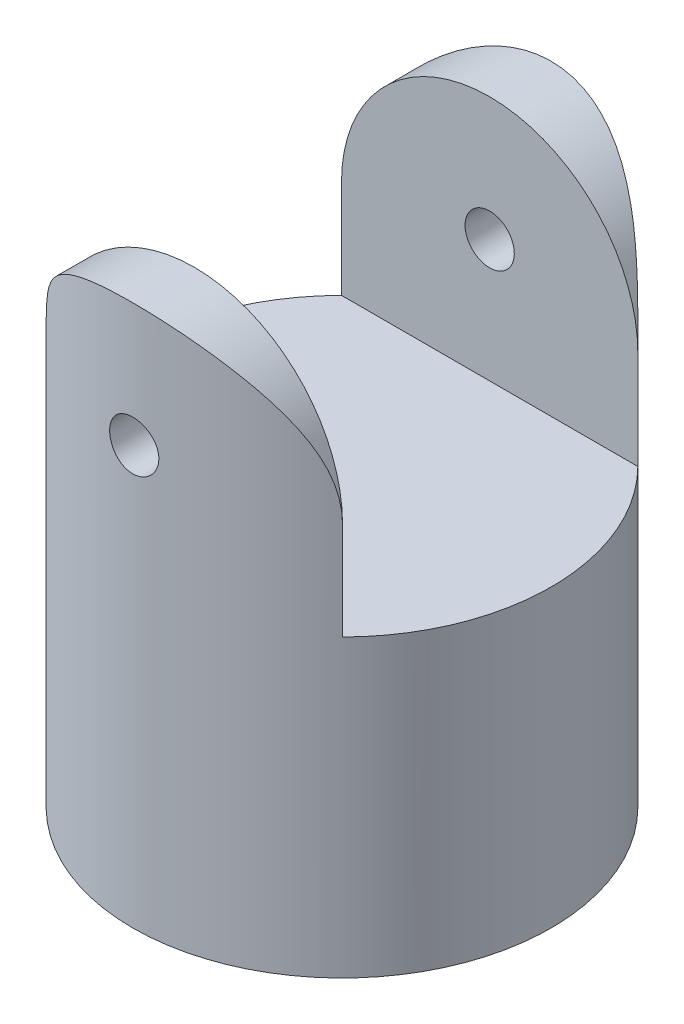
ISO-10303-21;
HEADER;
FILE_DESCRIPTION(('STEP AP214'),'2;1');
FILE_NAME('part.step','',(''),(''),'','','');
FILE_SCHEMA(('AUTOMOTIVE_DESIGN { 1 0 10303 214 1 1 1 1 }'));
ENDSEC;
DATA;
#1=APPLICATION_CONTEXT('core data for automotive mechanical design processes');
#2=APPLICATION_PROTOCOL_DEFINITION('international standard','automotive_design',2000,#1);
#3=PRODUCT_CONTEXT('',#1,'mechanical');
#4=PRODUCT('Part','Part','',(#3));
#5=PRODUCT_RELATED_PRODUCT_CATEGORY('part','',(#4));
#6=PRODUCT_DEFINITION_FORMATION('','',#4);
#7=PRODUCT_DEFINITION_CONTEXT('part definition',#1,'design');
#8=PRODUCT_DEFINITION('design','',#6,#7);
#9=PRODUCT_DEFINITION_SHAPE('','',#8);
#10=(LENGTH_UNIT() NAMED_UNIT(*) SI_UNIT(.MILLI.,.METRE.));
#11=(NAMED_UNIT(*) PLANE_ANGLE_UNIT() SI_UNIT($,.RADIAN.));
#12=(NAMED_UNIT(*) SI_UNIT($,.STERADIAN.) SOLID_ANGLE_UNIT());
#13=UNCERTAINTY_MEASURE_WITH_UNIT(LENGTH_MEASURE(1.E-05),#10,'distance_accuracy_value','');
#14=(GEOMETRIC_REPRESENTATION_CONTEXT(3) GLOBAL_UNCERTAINTY_ASSIGNED_CONTEXT((#13)) GLOBAL_UNIT_ASSIGNED_CONTEXT((#10,
#11,#12)) REPRESENTATION_CONTEXT('',''));
#15=CARTESIAN_POINT('',(0.,0.,0.));
#16=DIRECTION('',(0.,0.,1.));
#17=DIRECTION('',(1.,0.,0.));
#18=AXIS2_PLACEMENT_3D('',#15,#16,#17);
#19=CARTESIAN_POINT('',(4.25,6.,-3.));
#20=DIRECTION('',(0.,0.,-1.));
#21=DIRECTION('',(-1.,0.,0.));
#22=AXIS2_PLACEMENT_3D('',#19,#20,#21);
#23=PLANE('',#22);
#24=CARTESIAN_POINT('',(0.,8.48960135530192,-3.));
#25=DIRECTION('',(0.,0.,-1.));
#26=DIRECTION('',(-1.,0.,0.));
#27=AXIS2_PLACEMENT_3D('',#24,#25,#26);
#28=CIRCLE('',#27,0.500000000000001);
#29=CARTESIAN_POINT('',(-0.500000000000001,8.48960135530192,-3.));
#30=VERTEX_POINT('',#29);
#31=EDGE_CURVE('E166',#30,#30,#28,.T.);
#32=ORIENTED_EDGE('',*,*,#31,.T.);
#33=EDGE_LOOP('',(#32));
#34=FACE_BOUND('',#33,.T.);
#35=DIRECTION('',(0.,-1.,0.));
#36=VECTOR('',#35,1.);
#37=CARTESIAN_POINT('',(3.01039864469807,11.,-3.));
#38=LINE('',#37,#36);
#39=CARTESIAN_POINT('',(3.01039864469807,7.98960135530192,-3.));
#40=VERTEX_POINT('',#39);
#41=CARTESIAN_POINT('',(3.01039864469807,6.,-3.));
#42=VERTEX_POINT('',#41);
#43=EDGE_CURVE('E103',#40,#42,#38,.T.);
#44=ORIENTED_EDGE('',*,*,#43,.F.);
#45=CARTESIAN_POINT('',(0.,7.98960135530192,-3.));
#46=DIRECTION('',(0.,0.,-1.));
#47=DIRECTION('',(-1.,0.,0.));
#48=AXIS2_PLACEMENT_3D('',#45,#46,#47);
#49=CIRCLE('',#48,3.01039864469807);
#50=CARTESIAN_POINT('',(-3.01039864469807,7.98960135530192,-3.));
#51=VERTEX_POINT('',#50);
#52=EDGE_CURVE('E107',#40,#51,#49,.F.);
#53=ORIENTED_EDGE('',*,*,#52,.T.);
#54=DIRECTION('',(0.,-1.,0.));
#55=VECTOR('',#54,1.);
#56=CARTESIAN_POINT('',(-3.01039864469807,11.,-3.));
#57=LINE('',#56,#55);
#58=CARTESIAN_POINT('',(-3.01039864469807,6.,-3.));
#59=VERTEX_POINT('',#58);
#60=EDGE_CURVE('E82',#59,#51,#57,.F.);
#61=ORIENTED_EDGE('',*,*,#60,.F.);
#62=DIRECTION('',(-1.,0.,0.));
#63=VECTOR('',#62,1.);
#64=CARTESIAN_POINT('',(4.25,6.,-3.));
#65=LINE('',#64,#63);
#66=EDGE_CURVE('E112',#42,#59,#65,.T.);
#67=ORIENTED_EDGE('',*,*,#66,.F.);
#68=EDGE_LOOP('',(#44,#53,#61,#67));
#69=FACE_BOUND('',#68,.T.);
#70=ADVANCED_FACE('F54',(#34,#69),#23,.F.);
#71=CARTESIAN_POINT('',(4.25,6.,3.));
#72=DIRECTION('',(0.,0.,1.));
#73=DIRECTION('',(1.,0.,0.));
#74=AXIS2_PLACEMENT_3D('',#71,#72,#73);
#75=PLANE('',#74);
#76=CARTESIAN_POINT('',(0.,8.48960135530192,3.));
#77=DIRECTION('',(0.,0.,1.));
#78=DIRECTION('',(1.,0.,0.));
#79=AXIS2_PLACEMENT_3D('',#76,#77,#78);
#80=CIRCLE('',#79,0.500000000000001);
#81=CARTESIAN_POINT('',(0.500000000000001,8.48960135530192,3.));
#82=VERTEX_POINT('',#81);
#83=EDGE_CURVE('E168',#82,#82,#80,.T.);
#84=ORIENTED_EDGE('',*,*,#83,.T.);
#85=EDGE_LOOP('',(#84));
#86=FACE_BOUND('',#85,.T.);
#87=CARTESIAN_POINT('',(0.,7.98960135530192,3.));
#88=DIRECTION('',(0.,0.,1.));
#89=DIRECTION('',(1.,0.,0.));
#90=AXIS2_PLACEMENT_3D('',#87,#88,#89);
#91=CIRCLE('',#90,3.01039864469807);
#92=CARTESIAN_POINT('',(-3.01039864469807,7.98960135530192,3.));
#93=VERTEX_POINT('',#92);
#94=CARTESIAN_POINT('',(3.01039864469807,7.98960135530192,3.));
#95=VERTEX_POINT('',#94);
#96=EDGE_CURVE('E12',#93,#95,#91,.F.);
#97=ORIENTED_EDGE('',*,*,#96,.T.);
#98=DIRECTION('',(0.,-1.,0.));
#99=VECTOR('',#98,1.);
#100=CARTESIAN_POINT('',(3.01039864469807,11.,3.));
#101=LINE('',#100,#99);
#102=CARTESIAN_POINT('',(3.01039864469807,6.,3.));
#103=VERTEX_POINT('',#102);
#104=EDGE_CURVE('E155',#103,#95,#101,.F.);
#105=ORIENTED_EDGE('',*,*,#104,.F.);
#106=DIRECTION('',(1.,0.,0.));
#107=VECTOR('',#106,1.);
#108=CARTESIAN_POINT('',(4.25,6.,3.));
#109=LINE('',#108,#107);
#110=CARTESIAN_POINT('',(-3.01039864469807,6.,3.));
#111=VERTEX_POINT('',#110);
#112=EDGE_CURVE('E106',#111,#103,#109,.T.);
#113=ORIENTED_EDGE('',*,*,#112,.F.);
#114=DIRECTION('',(0.,-1.,0.));
#115=VECTOR('',#114,1.);
#116=CARTESIAN_POINT('',(-3.01039864469807,11.,3.));
#117=LINE('',#116,#115);
#118=EDGE_CURVE('E118',#93,#111,#117,.T.);
#119=ORIENTED_EDGE('',*,*,#118,.F.);
#120=EDGE_LOOP('',(#97,#105,#113,#119));
#121=FACE_BOUND('',#120,.T.);
#122=ADVANCED_FACE('F164',(#86,#121),#75,.F.);
#123=CARTESIAN_POINT('',(0.,11.,0.));
#124=DIRECTION('',(0.,-1.,0.));
#125=DIRECTION('',(0.,0.,-1.));
#126=AXIS2_PLACEMENT_3D('',#123,#124,#125);
#127=CYLINDRICAL_SURFACE('',#126,4.25);
#128=CARTESIAN_POINT('',(0.,8.98960135530192,-4.25));
#129=CARTESIAN_POINT('',(-0.0279815079339257,8.9896001587393,-4.24999962879993));
#130=CARTESIAN_POINT('',(-0.0559808233878626,8.98724454472455,-4.24972073531522));
#131=CARTESIAN_POINT('',(-0.111201240005855,8.97788420786294,-4.24863499754332));
#132=CARTESIAN_POINT('',(-0.138421482295665,8.97087454570789,-4.24782759236329));
#133=CARTESIAN_POINT('',(-0.191276259154801,8.95241470752944,-4.24577584783682));
#134=CARTESIAN_POINT('',(-0.216911813922851,8.94096742364097,-4.2445317931182));
#135=CARTESIAN_POINT('',(-0.265892779990901,8.91396339777201,-4.24174534846761));
#136=CARTESIAN_POINT('',(-0.289238602821198,8.89840739610845,-4.24020301229398));
#137=CARTESIAN_POINT('',(-0.333096954110287,8.8635458936023,-4.2369839309632));
#138=CARTESIAN_POINT('',(-0.353596648577672,8.84422429659391,-4.2353066276274));
#139=CARTESIAN_POINT('',(-0.391070365852068,8.80241458146309,-4.23201119081336));
#140=CARTESIAN_POINT('',(-0.408044214438334,8.7799263069594,-4.23039306026224));
#141=CARTESIAN_POINT('',(-0.438031551615227,8.7323390685543,-4.22739363633908));
#142=CARTESIAN_POINT('',(-0.451033134280633,8.7072325529738,-4.22601306027856));
#143=CARTESIAN_POINT('',(-0.472630845060755,8.65517356741626,-4.22365230908604));
#144=CARTESIAN_POINT('',(-0.481227121618453,8.62822115967386,-4.22267212046265));
#145=CARTESIAN_POINT('',(-0.493731473323603,8.57336805072095,-4.22122838434837));
#146=CARTESIAN_POINT('',(-0.49766111518059,8.54547232948427,-4.22076246090767));
#147=CARTESIAN_POINT('',(-0.500787362974983,8.48941374014719,-4.22039271111274));
#148=CARTESIAN_POINT('',(-0.49998413827067,8.46125088164188,-4.22048886464546));
#149=CARTESIAN_POINT('',(-0.493685179218808,8.40560723862786,-4.22123023105053));
#150=CARTESIAN_POINT('',(-0.488213134767233,8.37812373021814,-4.22187267196956));
#151=CARTESIAN_POINT('',(-0.472768797544088,8.32446783496169,-4.22362990200204));
#152=CARTESIAN_POINT('',(-0.462796423147606,8.29829547190547,-4.22474469968287));
#153=CARTESIAN_POINT('',(-0.4386088254498,8.24793081598535,-4.22732419349506));
#154=CARTESIAN_POINT('',(-0.42438323934452,8.22374354531078,-4.22878974245956));
#155=CARTESIAN_POINT('',(-0.392100453568894,8.17809067012562,-4.23190493231599));
#156=CARTESIAN_POINT('',(-0.374043098589418,8.15662517599033,-4.23355458066854));
#157=CARTESIAN_POINT('',(-0.334477742302349,8.11688762624628,-4.23686443029286));
#158=CARTESIAN_POINT('',(-0.312949308804201,8.09863590835924,-4.23852463439005));
#159=CARTESIAN_POINT('',(-0.267123447685407,8.06600213496605,-4.24165906630372));
#160=CARTESIAN_POINT('',(-0.24282601485749,8.05162008673722,-4.24313329377045));
#161=CARTESIAN_POINT('',(-0.192136690548972,8.02713415507867,-4.2457304372909));
#162=CARTESIAN_POINT('',(-0.165744215582293,8.01703146848454,-4.24685325504078));
#163=CARTESIAN_POINT('',(-0.11162136655461,8.00140678927347,-4.24862014754254));
#164=CARTESIAN_POINT('',(-0.0838910479901182,7.99588460682035,-4.24926424213468));
#165=CARTESIAN_POINT('',(-0.0280556097911018,7.98960387251919,-4.24999854795077));
#166=CARTESIAN_POINT('',(4.63155470333871E-05,7.98881728928554,-4.25009201840766));
#167=CARTESIAN_POINT('',(0.0559815839393778,7.99195621777904,-4.24972332514429));
#168=CARTESIAN_POINT('',(0.0838149320368983,7.99588164085045,-4.24926117187801));
#169=CARTESIAN_POINT('',(0.138340819637319,8.0083098758353,-4.2478352042638));
#170=CARTESIAN_POINT('',(0.165036429606704,8.01679939815491,-4.24687284666308));
#171=CARTESIAN_POINT('',(0.216624914634591,8.03810107923965,-4.24455427829725));
#172=CARTESIAN_POINT('',(0.241517734890418,8.05091336934488,-4.24319805556539));
#173=CARTESIAN_POINT('',(0.288919707675085,8.08056524937489,-4.24023498411094));
#174=CARTESIAN_POINT('',(0.311417389736759,8.09742306214044,-4.23862701313332));
#175=CARTESIAN_POINT('',(0.353273945647894,8.13466156631829,-4.23534404116773));
#176=CARTESIAN_POINT('',(0.372632709546316,8.15504238108381,-4.2336690378343));
#177=CARTESIAN_POINT('',(0.407760689541942,8.19887146670309,-4.23043080559362));
#178=CARTESIAN_POINT('',(0.423511381640241,8.22233463515569,-4.22886818056959));
#179=CARTESIAN_POINT('',(0.450848343062906,8.27158973076475,-4.22604134423734));
#180=CARTESIAN_POINT('',(0.462434687710245,8.29738161578979,-4.22477712753179));
#181=CARTESIAN_POINT('',(0.481083745146007,8.35050105101122,-4.22269426717638));
#182=CARTESIAN_POINT('',(0.488157084320231,8.37782482776979,-4.22187457752541));
#183=CARTESIAN_POINT('',(0.497613651912149,8.43328250635485,-4.22077050900715));
#184=CARTESIAN_POINT('',(0.499997071709947,8.46141637507663,-4.22048610829652));
#185=CARTESIAN_POINT('',(0.500002905104655,8.5175113960436,-4.22048540256237));
#186=CARTESIAN_POINT('',(0.497654418165977,8.54547254970952,-4.220765625315));
#187=CARTESIAN_POINT('',(0.488324531998946,8.6005999000078,-4.22185514735485));
#188=CARTESIAN_POINT('',(0.481343130600762,8.62776609626783,-4.22266444688986));
#189=CARTESIAN_POINT('',(0.462954362038872,8.68052967933182,-4.22471989654735));
#190=CARTESIAN_POINT('',(0.451548226947953,8.70612750055627,-4.22596592505277));
#191=CARTESIAN_POINT('',(0.424636654092962,8.75505036940342,-4.22875465314459));
#192=CARTESIAN_POINT('',(0.409131188271347,8.77837540146869,-4.23029735476154));
#193=CARTESIAN_POINT('',(0.374352642992924,8.82223950205158,-4.23351697960572));
#194=CARTESIAN_POINT('',(0.355057860922863,8.84276130996363,-4.23519464147394));
#195=CARTESIAN_POINT('',(0.313293193141343,8.88028739849701,-4.23848855227954));
#196=CARTESIAN_POINT('',(0.290822556421585,8.8972908447657,-4.24010478657583));
#197=CARTESIAN_POINT('',(0.243257780273886,8.9273456035371,-4.24309969036009));
#198=CARTESIAN_POINT('',(0.218155018171478,8.94038334391015,-4.24447753721309));
#199=CARTESIAN_POINT('',(0.166114874556124,8.96204017038033,-4.24683194106318));
#200=CARTESIAN_POINT('',(0.139179547564886,8.97066411531169,-4.24780893909017));
#201=CARTESIAN_POINT('',(0.093417125252317,8.98115678644538,-4.24901286739211));
#202=CARTESIAN_POINT('',(0.0748799482556944,8.98431902060356,-4.24938126339164));
#203=CARTESIAN_POINT('',(0.0375645220996615,8.9885417001258,-4.24987495354286));
#204=CARTESIAN_POINT('',(0.0187862744507022,8.98960215865226,-4.25000024921696));
#205=CARTESIAN_POINT('',(0.,8.98960135530192,-4.25));
#206=B_SPLINE_CURVE_WITH_KNOTS('',3,(#128,#129,#130,#131,#132,#133,#134,#135,#136,#137,#138,
#139,#140,#141,#142,#143,#144,#145,#146,#147,#148,#149,#150,#151,#152,#153,#154,#155,#156,#157,
#158,#159,#160,#161,#162,#163,#164,#165,#166,#167,#168,#169,#170,#171,#172,#173,#174,#175,#176,
#177,#178,#179,#180,#181,#182,#183,#184,#185,#186,#187,#188,#189,#190,#191,#192,#193,#194,#195,
#196,#197,#198,#199,#200,#201,#202,#203,#204,#205),.UNSPECIFIED.,.T.,.F.,(4,2,2,2,2,2,2,2,2,2,2,
2,2,2,2,2,2,2,2,2,2,2,2,2,2,2,2,2,2,2,2,2,2,2,2,2,2,2,4),(0.,0.0838759099272431,
0.167840979355759,0.25175141791053,0.335646747617583,0.419908883930186,0.504175182852993,
0.588691626764541,0.673205222588432,0.757326702297115,0.841445171867568,0.925139339972476,
1.00883502614466,1.09273631920843,1.17664101360642,1.26105895955267,1.34547706425459,
1.42991876312732,1.51435696219094,1.59829485173446,1.68223116202302,1.76592438264929,
1.84962014638355,1.9337002334846,2.01778326513417,2.10228876291848,2.18679273212583,
2.27109698556679,2.35539779875855,2.43918177566994,2.52296579182169,2.60672649493303,
2.69048777135266,2.77474355331106,2.85901929304509,2.94358029222493,3.02804800289385,
3.08436111280422,3.14067387005148),.UNSPECIFIED.);
#207=CARTESIAN_POINT('',(0.,8.98960135530192,-4.25));
#208=VERTEX_POINT('',#207);
#209=EDGE_CURVE('E59',#208,#208,#206,.T.);
#210=ORIENTED_EDGE('',*,*,#209,.T.);
#211=EDGE_LOOP('',(#210));
#212=FACE_BOUND('',#211,.T.);
#213=CARTESIAN_POINT('',(0.500000000000001,8.48960135530192,4.22048575403353));
#214=CARTESIAN_POINT('',(0.499998802769243,8.46162060287214,4.22048613493212));
#215=CARTESIAN_POINT('',(0.497643311661282,8.43362204065477,4.22076701475814));
#216=CARTESIAN_POINT('',(0.488283507345756,8.378403188962,4.22185984620558));
#217=CARTESIAN_POINT('',(0.481274252183018,8.35118375895464,4.22267236237237));
#218=CARTESIAN_POINT('',(0.462815604479552,8.29833070003574,4.22473518925075));
#219=CARTESIAN_POINT('',(0.451369123390499,8.27269604404846,4.22598521284309));
#220=CARTESIAN_POINT('',(0.424366988324421,8.22371658525304,4.22878186041533));
#221=CARTESIAN_POINT('',(0.408812072707322,8.20037137202343,4.23032843108668));
#222=CARTESIAN_POINT('',(0.373951669528781,8.15651233775407,4.2335525299114));
#223=CARTESIAN_POINT('',(0.354629842957993,8.13601154252106,4.23523060880403));
#224=CARTESIAN_POINT('',(0.31281920579606,8.09853569921053,4.23852368122868));
#225=CARTESIAN_POINT('',(0.290330241835383,8.08156082197517,4.24013867170079));
#226=CARTESIAN_POINT('',(0.242742394010224,8.05157240488422,4.24312918712801));
#227=CARTESIAN_POINT('',(0.217636077061608,8.038570583205,4.24450399868533));
#228=CARTESIAN_POINT('',(0.165577523060142,8.0169723758203,4.24685321538206));
#229=CARTESIAN_POINT('',(0.138625347069891,8.00837584446377,4.24782763375937));
#230=CARTESIAN_POINT('',(0.0837729693577212,7.99587096661411,4.24926239804801));
#231=CARTESIAN_POINT('',(0.0558777527319361,7.99194102899745,4.24972511080011));
#232=CARTESIAN_POINT('',(-0.000179846980551866,7.98881401482633,4.25009240155345));
#233=CARTESIAN_POINT('',(-0.0283422206558494,7.98961677216215,4.2499969991436));
#234=CARTESIAN_POINT('',(-0.0839879134193268,7.99591498701499,4.24926073061673));
#235=CARTESIAN_POINT('',(-0.111473901286669,8.00138722525633,4.24862256348146));
#236=CARTESIAN_POINT('',(-0.165134655242896,8.01683280784698,4.24687552118457));
#237=CARTESIAN_POINT('',(-0.191309398832217,8.02680622940247,4.24576663794905));
#238=CARTESIAN_POINT('',(-0.241676956929765,8.05099600398461,4.24319812949024));
#239=CARTESIAN_POINT('',(-0.265864866888629,8.065222476933,4.24173766933998));
#240=CARTESIAN_POINT('',(-0.311518645380725,8.09750716016198,4.23862955620758));
#241=CARTESIAN_POINT('',(-0.33298440324466,8.11556552614874,4.23698189561997));
#242=CARTESIAN_POINT('',(-0.372720826898213,8.1551316048483,4.23367216138388));
#243=CARTESIAN_POINT('',(-0.390971358625034,8.17665954201118,4.2320100608738));
#244=CARTESIAN_POINT('',(-0.42360297450392,8.22248398557116,4.2288686556955));
#245=CARTESIAN_POINT('',(-0.43798404888651,8.24678049895805,4.22738935148879));
#246=CARTESIAN_POINT('',(-0.462469277872916,8.29746956319654,4.22478100924617));
#247=CARTESIAN_POINT('',(-0.472571936852711,8.32386284320114,4.2236520937339));
#248=CARTESIAN_POINT('',(-0.488196314642034,8.37798744371342,4.22187479144295));
#249=CARTESIAN_POINT('',(-0.493718228239623,8.40571870727266,4.22122638423163));
#250=CARTESIAN_POINT('',(-0.499997947191898,8.46155460240286,4.22048719542144));
#251=CARTESIAN_POINT('',(-0.500784034244721,8.4896560110831,4.22039310360292));
#252=CARTESIAN_POINT('',(-0.497644297783155,8.54559012736867,4.22076445134102));
#253=CARTESIAN_POINT('',(-0.493718562973558,8.57342284002254,4.2212298803641));
#254=CARTESIAN_POINT('',(-0.481290385360945,8.62794547823471,4.22266481070323));
#255=CARTESIAN_POINT('',(-0.472801534968225,8.65463854491359,4.22363281467993));
#256=CARTESIAN_POINT('',(-0.451502048370051,8.70622224019145,4.22596261272263));
#257=CARTESIAN_POINT('',(-0.438691276841937,8.7311128123233,4.22732441911869));
#258=CARTESIAN_POINT('',(-0.40904164781771,8.77851322504842,4.23029633884129));
#259=CARTESIAN_POINT('',(-0.392184182083649,8.80101135365128,4.23190758667054));
#260=CARTESIAN_POINT('',(-0.354946106547777,8.8428689719006,4.23519323546819));
#261=CARTESIAN_POINT('',(-0.334565375613502,8.86222835359026,4.23686763860636));
#262=CARTESIAN_POINT('',(-0.290736026305491,8.89735770902096,4.24010105070431));
#263=CARTESIAN_POINT('',(-0.267272494242877,8.91310914105109,4.24165943696604));
#264=CARTESIAN_POINT('',(-0.218016470245115,8.94044740007437,4.2444759980383));
#265=CARTESIAN_POINT('',(-0.192224020620732,8.95203430270784,4.24573417830133));
#266=CARTESIAN_POINT('',(-0.139104909063215,8.97068372050145,4.24780578730548));
#267=CARTESIAN_POINT('',(-0.111782106151602,8.97775710383083,4.24862028370153));
#268=CARTESIAN_POINT('',(-0.0563264847073938,8.98721408957459,4.24971717145721));
#269=CARTESIAN_POINT('',(-0.0281936983700433,8.98959787813073,4.24999958393655));
#270=CARTESIAN_POINT('',(0.0279019239333326,8.98960480406957,4.2500004126797));
#271=CARTESIAN_POINT('',(0.0558647606677075,8.98725659217908,4.24972222320621));
#272=CARTESIAN_POINT('',(0.110995546735373,8.9779266647914,4.24863983296946));
#273=CARTESIAN_POINT('',(0.13816349620235,8.9709449500735,4.24783563229466));
#274=CARTESIAN_POINT('',(0.190930654019737,8.952554874961,4.24579121611378));
#275=CARTESIAN_POINT('',(0.216530288025219,8.94114772188894,4.24455111953498));
#276=CARTESIAN_POINT('',(0.265456358840332,8.91423355056405,4.24177251750569));
#277=CARTESIAN_POINT('',(0.288782781219184,8.89872650628665,4.24023401016103));
#278=CARTESIAN_POINT('',(0.332646848405472,8.863946204954,4.23701939182347));
#279=CARTESIAN_POINT('',(0.353167518319834,8.84465160760804,4.23534253388664));
#280=CARTESIAN_POINT('',(0.390691396964022,8.80288778023984,4.23204631478947));
#281=CARTESIAN_POINT('',(0.40769376833244,8.78041779660654,4.23042696739252));
#282=CARTESIAN_POINT('',(0.437747346922264,8.73285357231707,4.22742319257257));
#283=CARTESIAN_POINT('',(0.450784794962641,8.70775059077425,4.22603959037915));
#284=CARTESIAN_POINT('',(0.472441014440355,8.65570998594812,4.22367366563801));
#285=CARTESIAN_POINT('',(0.481064648382866,8.62877441878119,4.22269090174791));
#286=CARTESIAN_POINT('',(0.491556459474267,8.58301282522832,4.22147949187928));
#287=CARTESIAN_POINT('',(0.494718306528706,8.56447677774365,4.22110866605391));
#288=CARTESIAN_POINT('',(0.498940471930464,8.5271636133375,4.22061167005659));
#289=CARTESIAN_POINT('',(0.500000803772189,8.50838649796474,4.22048549831367));
#290=CARTESIAN_POINT('',(0.500000000000001,8.48960135530192,4.22048575403353));
#291=B_SPLINE_CURVE_WITH_KNOTS('',3,(#213,#214,#215,#216,#217,#218,#219,#220,#221,#222,#223,
#224,#225,#226,#227,#228,#229,#230,#231,#232,#233,#234,#235,#236,#237,#238,#239,#240,#241,#242,
#243,#244,#245,#246,#247,#248,#249,#250,#251,#252,#253,#254,#255,#256,#257,#258,#259,#260,#261,
#262,#263,#264,#265,#266,#267,#268,#269,#270,#271,#272,#273,#274,#275,#276,#277,#278,#279,#280,
#281,#282,#283,#284,#285,#286,#287,#288,#289,#290),.UNSPECIFIED.,.T.,.F.,(4,2,2,2,2,2,2,2,2,2,2,
2,2,2,2,2,2,2,2,2,2,2,2,2,2,2,2,2,2,2,2,2,2,2,2,2,2,2,4),(0.,0.0838736403661387,
0.167836491131575,0.251744343313317,0.335637125986375,0.419902232684004,0.504171421347435,
0.588686807548579,0.673199399257506,0.757319430275102,0.841436508837385,0.925137731458884,
1.00884038981317,1.09274382147801,1.17665066315033,1.26106557970777,1.34548070939116,
1.42992532412352,1.51436634781456,1.59830259757347,1.68223726717272,1.76592329018441,
1.84961193371279,1.93369304061155,2.01777703885608,2.10228391693197,2.18678926003228,
2.27109034588649,2.35538808555208,2.43917696334357,2.52296582704306,2.60673184800488,
2.69049840069469,2.77475121780966,2.85902406424231,2.94358610444671,3.02805478475966,
3.0843645077094,3.14067386907779),.UNSPECIFIED.);
#292=CARTESIAN_POINT('',(0.500000000000001,8.48960135530192,4.22048575403353));
#293=VERTEX_POINT('',#292);
#294=EDGE_CURVE('E122',#293,#293,#291,.T.);
#295=ORIENTED_EDGE('',*,*,#294,.T.);
#296=EDGE_LOOP('',(#295));
#297=FACE_BOUND('',#296,.T.);
#298=CARTESIAN_POINT('',(-3.01039864469807,7.98960135530192,-3.));
#299=CARTESIAN_POINT('',(-3.01041966422345,8.06213322387627,-2.99995218188141));
#300=CARTESIAN_POINT('',(-3.00777829564429,8.13463396279667,-3.00262920037796));
#301=CARTESIAN_POINT('',(-2.99734131974156,8.27877898847996,-3.01306180444948));
#302=CARTESIAN_POINT('',(-2.98955425028147,8.35042449413324,-3.02080897730525));
#303=CARTESIAN_POINT('',(-2.96911091643669,8.49151215162661,-3.04089950849197));
#304=CARTESIAN_POINT('',(-2.95651035608459,8.56097001652359,-3.05319023594014));
#305=CARTESIAN_POINT('',(-2.92669279602958,8.69804544381338,-3.08178496372699));
#306=CARTESIAN_POINT('',(-2.90947408598693,8.76566231415033,-3.09809045075508));
#307=CARTESIAN_POINT('',(-2.85155121138235,8.96432365628765,-3.15181036676227));
#308=CARTESIAN_POINT('',(-2.80442539873864,9.09220396309824,-3.19419130681505));
#309=CARTESIAN_POINT('',(-2.69478556204581,9.33825950774858,-3.28721894182181));
#310=CARTESIAN_POINT('',(-2.6322214713135,9.45640146699957,-3.33789234565676));
#311=CARTESIAN_POINT('',(-2.48056624726003,9.70241834785216,-3.45251590084471));
#312=CARTESIAN_POINT('',(-2.38873158955949,9.82825166063107,-3.51721919904223));
#313=CARTESIAN_POINT('',(-2.18664472000324,10.0645084614319,-3.64629471717614));
#314=CARTESIAN_POINT('',(-2.07638437391617,10.1749251038973,-3.7106667778893));
#315=CARTESIAN_POINT('',(-1.88765883268576,10.3364459525023,-3.80860169196331));
#316=CARTESIAN_POINT('',(-1.81487244845732,10.3932108107828,-3.84390765847995));
#317=CARTESIAN_POINT('',(-1.66354345211429,10.5003202188961,-3.91177560168134));
#318=CARTESIAN_POINT('',(-1.58500355568445,10.5506677673715,-3.94433885753312));
#319=CARTESIAN_POINT('',(-1.42254478626514,10.6443429321479,-4.00579654844544));
#320=CARTESIAN_POINT('',(-1.33862914414583,10.687674710758,-4.03469315663358));
#321=CARTESIAN_POINT('',(-1.16589710723062,10.7666853729303,-4.0879510101683));
#322=CARTESIAN_POINT('',(-1.07708207528178,10.8023663713231,-4.11231350858813));
#323=CARTESIAN_POINT('',(-0.908284681716838,10.8608936292354,-4.15258190143711));
#324=CARTESIAN_POINT('',(-0.828854393714931,10.8848454514931,-4.16919880853941));
#325=CARTESIAN_POINT('',(-0.66754299746365,10.926234731196,-4.19804654759877));
#326=CARTESIAN_POINT('',(-0.585662450505599,10.9436736684223,-4.21027837585659));
#327=CARTESIAN_POINT('',(-0.420259319465499,10.9716996437802,-4.22998947668955));
#328=CARTESIAN_POINT('',(-0.336738564968289,10.982293914161,-4.2374737654833));
#329=CARTESIAN_POINT('',(-0.16881032734403,10.9964438049038,-4.24747881645847));
#330=CARTESIAN_POINT('',(-0.0844029389236896,11.0000001694935,-4.25000010345539));
#331=CARTESIAN_POINT('',(0.0746364637434601,10.999999850119,-4.24999990851569));
#332=CARTESIAN_POINT('',(0.149269448139029,10.9972186172675,-4.24802817950872));
#333=CARTESIAN_POINT('',(0.297927790261864,10.9861505332229,-4.24019982401667));
#334=CARTESIAN_POINT('',(0.371952931560867,10.9778618003479,-4.23434186977249));
#335=CARTESIAN_POINT('',(0.5921884468289,10.9448973126696,-4.21111721563017));
#336=CARTESIAN_POINT('',(0.73669794960862,10.9121229471012,-4.18809936372096));
#337=CARTESIAN_POINT('',(1.01609427817,10.8270901129152,-4.12921505251761));
#338=CARTESIAN_POINT('',(1.1510243270364,10.7749267983116,-4.09341137461023));
#339=CARTESIAN_POINT('',(1.40956122977424,10.6534411335688,-4.01173523772296));
#340=CARTESIAN_POINT('',(1.53316653341205,10.5841164390186,-3.96586140315899));
#341=CARTESIAN_POINT('',(1.7779695232703,10.4236584237911,-3.86270862767198));
#342=CARTESIAN_POINT('',(1.89797128943629,10.3311322627737,-3.80477765925848));
#343=CARTESIAN_POINT('',(2.12186711954726,10.1303577280041,-3.68460810825382));
#344=CARTESIAN_POINT('',(2.22573652820742,10.0220857693263,-3.62236313844092));
#345=CARTESIAN_POINT('',(2.37727883412394,9.83861307887735,-3.5235730347497));
#346=CARTESIAN_POINT('',(2.43055162318514,9.76801560709285,-3.48693704476267));
#347=CARTESIAN_POINT('',(2.53092262473453,9.62201886303851,-3.41478544268794));
#348=CARTESIAN_POINT('',(2.5780191411393,9.5466182801836,-3.37927014038022));
#349=CARTESIAN_POINT('',(2.70950020300864,9.31356306270109,-3.27618965883864));
#350=CARTESIAN_POINT('',(2.78435098701947,9.14872446613716,-3.21190179033222));
#351=CARTESIAN_POINT('',(2.8857273166335,8.85619028681534,-3.12061593082277));
#352=CARTESIAN_POINT('',(2.9200425405401,8.73289296359797,-3.08823903868769));
#353=CARTESIAN_POINT('',(2.95968711208906,8.54359198201054,-3.05009454342244));
#354=CARTESIAN_POINT('',(2.97092430321218,8.47984329306832,-3.03912331811406));
#355=CARTESIAN_POINT('',(2.98930348439388,8.35123072728444,-3.02104868606962));
#356=CARTESIAN_POINT('',(2.99644779764315,8.2863675046522,-3.01394308525159));
#357=CARTESIAN_POINT('',(3.00444394301451,8.18274762725412,-3.00596624370445));
#358=CARTESIAN_POINT('',(3.0066747699763,8.14419307625463,-3.00373333243024));
#359=CARTESIAN_POINT('',(3.00965287070424,8.06696161342387,-3.00074847026246));
#360=CARTESIAN_POINT('',(3.01039983334875,8.02828467763447,-2.99999682994703));
#361=CARTESIAN_POINT('',(3.01039864469807,7.98960135530192,-3.));
#362=B_SPLINE_CURVE_WITH_KNOTS('',3,(#298,#299,#300,#301,#302,#303,#304,#305,#306,#307,#308,
#309,#310,#311,#312,#313,#314,#315,#316,#317,#318,#319,#320,#321,#322,#323,#324,#325,#326,#327,
#328,#329,#330,#331,#332,#333,#334,#335,#336,#337,#338,#339,#340,#341,#342,#343,#344,#345,#346,
#347,#348,#349,#350,#351,#352,#353,#354,#355,#356,#357,#358,#359,#360,#361),.UNSPECIFIED.,.F.,
.F.,(4,2,2,2,2,2,2,2,2,2,2,2,2,2,2,2,2,2,2,2,2,2,2,2,2,2,2,2,2,2,2,4),(0.,0.217448133012551,
0.434536374052316,0.649184952889624,0.863913137235554,1.29026169209111,1.71801150752864,
2.22230781429231,2.72682733942815,3.02295297283868,3.31893972313812,3.61475022210167,
3.91047884734189,4.16393672535926,4.41733698056937,4.67046904681889,4.92357434403346,
5.14739219421416,5.37128655291447,5.81866420400725,6.26387466761037,6.70914598487836,
7.19409320557743,7.67977443486742,7.96665854018427,8.25362126330387,8.82615573109162,
9.22057610323459,9.41732435348135,9.61396081496856,9.72995971120195,9.84598292634241),.UNSPECIFIED.);
#363=EDGE_CURVE('E75',#51,#40,#362,.T.);
#364=ORIENTED_EDGE('',*,*,#363,.T.);
#365=ORIENTED_EDGE('',*,*,#43,.T.);
#366=CARTESIAN_POINT('',(0.,6.,0.));
#367=DIRECTION('',(0.,-1.,0.));
#368=DIRECTION('',(0.,0.,-1.));
#369=AXIS2_PLACEMENT_3D('',#366,#367,#368);
#370=CIRCLE('',#369,4.25);
#371=EDGE_CURVE('E68',#42,#103,#370,.T.);
#372=ORIENTED_EDGE('',*,*,#371,.T.);
#373=ORIENTED_EDGE('',*,*,#104,.T.);
#374=CARTESIAN_POINT('',(3.01039864469807,7.98960135530192,3.));
#375=CARTESIAN_POINT('',(3.01041966422345,8.06213322387627,2.99995218188141));
#376=CARTESIAN_POINT('',(3.00777829564429,8.13463396279667,3.00262920037796));
#377=CARTESIAN_POINT('',(2.99734131974156,8.27877898847996,3.01306180444948));
#378=CARTESIAN_POINT('',(2.98955425028147,8.35042449413324,3.02080897730525));
#379=CARTESIAN_POINT('',(2.96911091643669,8.49151215162661,3.04089950849197));
#380=CARTESIAN_POINT('',(2.95651035608459,8.56097001652359,3.05319023594014));
#381=CARTESIAN_POINT('',(2.92669279602958,8.69804544381338,3.08178496372699));
#382=CARTESIAN_POINT('',(2.90947408598693,8.76566231415033,3.09809045075508));
#383=CARTESIAN_POINT('',(2.85155121138235,8.96432365628765,3.15181036676227));
#384=CARTESIAN_POINT('',(2.80442539873864,9.09220396309824,3.19419130681505));
#385=CARTESIAN_POINT('',(2.69478556204581,9.33825950774858,3.28721894182181));
#386=CARTESIAN_POINT('',(2.6322214713135,9.45640146699957,3.33789234565676));
#387=CARTESIAN_POINT('',(2.48056624726003,9.70241834785216,3.45251590084471));
#388=CARTESIAN_POINT('',(2.38873158955949,9.82825166063107,3.51721919904223));
#389=CARTESIAN_POINT('',(2.18664472000324,10.0645084614319,3.64629471717614));
#390=CARTESIAN_POINT('',(2.07638437391617,10.1749251038973,3.7106667778893));
#391=CARTESIAN_POINT('',(1.88765883268576,10.3364459525023,3.80860169196331));
#392=CARTESIAN_POINT('',(1.81487244845732,10.3932108107828,3.84390765847995));
#393=CARTESIAN_POINT('',(1.66354345211429,10.5003202188961,3.91177560168134));
#394=CARTESIAN_POINT('',(1.58500355568445,10.5506677673715,3.94433885753312));
#395=CARTESIAN_POINT('',(1.42254478626514,10.6443429321479,4.00579654844544));
#396=CARTESIAN_POINT('',(1.33862914414583,10.687674710758,4.03469315663358));
#397=CARTESIAN_POINT('',(1.16589710723062,10.7666853729303,4.0879510101683));
#398=CARTESIAN_POINT('',(1.07708207528178,10.8023663713231,4.11231350858813));
#399=CARTESIAN_POINT('',(0.908284681716838,10.8608936292354,4.15258190143711));
#400=CARTESIAN_POINT('',(0.828854393714931,10.8848454514931,4.16919880853941));
#401=CARTESIAN_POINT('',(0.66754299746365,10.926234731196,4.19804654759877));
#402=CARTESIAN_POINT('',(0.585662450505599,10.9436736684223,4.21027837585659));
#403=CARTESIAN_POINT('',(0.420259319465499,10.9716996437802,4.22998947668955));
#404=CARTESIAN_POINT('',(0.33673856496829,10.982293914161,4.2374737654833));
#405=CARTESIAN_POINT('',(0.16881032734403,10.9964438049038,4.24747881645847));
#406=CARTESIAN_POINT('',(0.0844029389236896,11.0000001694935,4.25000010345539));
#407=CARTESIAN_POINT('',(-0.0746364637434604,10.999999850119,4.24999990851569));
#408=CARTESIAN_POINT('',(-0.149269448139029,10.9972186172675,4.24802817950872));
#409=CARTESIAN_POINT('',(-0.297927790261863,10.9861505332229,4.24019982401667));
#410=CARTESIAN_POINT('',(-0.371952931560866,10.9778618003479,4.23434186977249));
#411=CARTESIAN_POINT('',(-0.5921884468289,10.9448973126696,4.21111721563017));
#412=CARTESIAN_POINT('',(-0.73669794960862,10.9121229471012,4.18809936372096));
#413=CARTESIAN_POINT('',(-1.01609427817,10.8270901129152,4.12921505251761));
#414=CARTESIAN_POINT('',(-1.1510243270364,10.7749267983116,4.09341137461023));
#415=CARTESIAN_POINT('',(-1.40956122977424,10.6534411335688,4.01173523772295));
#416=CARTESIAN_POINT('',(-1.53316653341205,10.5841164390186,3.96586140315899));
#417=CARTESIAN_POINT('',(-1.7779695232703,10.4236584237911,3.86270862767198));
#418=CARTESIAN_POINT('',(-1.89797128943628,10.3311322627737,3.80477765925848));
#419=CARTESIAN_POINT('',(-2.12186711954726,10.1303577280041,3.68460810825382));
#420=CARTESIAN_POINT('',(-2.22573652820742,10.0220857693263,3.62236313844092));
#421=CARTESIAN_POINT('',(-2.37727883412394,9.83861307887735,3.5235730347497));
#422=CARTESIAN_POINT('',(-2.43055162318514,9.76801560709285,3.48693704476267));
#423=CARTESIAN_POINT('',(-2.53092262473453,9.6220188630385,3.41478544268794));
#424=CARTESIAN_POINT('',(-2.5780191411393,9.5466182801836,3.37927014038022));
#425=CARTESIAN_POINT('',(-2.70950020300863,9.31356306270109,3.27618965883864));
#426=CARTESIAN_POINT('',(-2.78435098701947,9.14872446613716,3.21190179033222));
#427=CARTESIAN_POINT('',(-2.8857273166335,8.85619028681535,3.12061593082278));
#428=CARTESIAN_POINT('',(-2.9200425405401,8.73289296359797,3.08823903868769));
#429=CARTESIAN_POINT('',(-2.95968711208906,8.54359198201055,3.05009454342244));
#430=CARTESIAN_POINT('',(-2.97092430321218,8.47984329306832,3.03912331811406));
#431=CARTESIAN_POINT('',(-2.98930348439388,8.35123072728444,3.02104868606962));
#432=CARTESIAN_POINT('',(-2.99644779764315,8.2863675046522,3.01394308525159));
#433=CARTESIAN_POINT('',(-3.00444394301451,8.18274762725412,3.00596624370445));
#434=CARTESIAN_POINT('',(-3.0066747699763,8.14419307625463,3.00373333243024));
#435=CARTESIAN_POINT('',(-3.00965287070424,8.06696161342387,3.00074847026246));
#436=CARTESIAN_POINT('',(-3.01039983334875,8.02828467763447,2.99999682994703));
#437=CARTESIAN_POINT('',(-3.01039864469807,7.98960135530192,3.));
#438=B_SPLINE_CURVE_WITH_KNOTS('',3,(#374,#375,#376,#377,#378,#379,#380,#381,#382,#383,#384,
#385,#386,#387,#388,#389,#390,#391,#392,#393,#394,#395,#396,#397,#398,#399,#400,#401,#402,#403,
#404,#405,#406,#407,#408,#409,#410,#411,#412,#413,#414,#415,#416,#417,#418,#419,#420,#421,#422,
#423,#424,#425,#426,#427,#428,#429,#430,#431,#432,#433,#434,#435,#436,#437),.UNSPECIFIED.,.F.,
.F.,(4,2,2,2,2,2,2,2,2,2,2,2,2,2,2,2,2,2,2,2,2,2,2,2,2,2,2,2,2,2,2,4),(0.,0.217448133012551,
0.434536374052316,0.649184952889624,0.863913137235554,1.29026169209111,1.71801150752864,
2.22230781429231,2.72682733942815,3.02295297283868,3.31893972313812,3.61475022210167,
3.91047884734189,4.16393672535926,4.41733698056937,4.67046904681888,4.92357434403346,
5.14739219421416,5.37128655291447,5.81866420400725,6.26387466761037,6.70914598487836,
7.19409320557743,7.67977443486742,7.96665854018427,8.25362126330387,8.82615573109162,
9.22057610323459,9.41732435348135,9.61396081496855,9.72995971120195,9.84598292634241),.UNSPECIFIED.);
#439=EDGE_CURVE('E110',#95,#93,#438,.T.);
#440=ORIENTED_EDGE('',*,*,#439,.T.);
#441=ORIENTED_EDGE('',*,*,#118,.T.);
#442=EDGE_CURVE('E116',#111,#59,#370,.T.);
#443=ORIENTED_EDGE('',*,*,#442,.T.);
#444=ORIENTED_EDGE('',*,*,#60,.T.);
#445=EDGE_LOOP('',(#364,#365,#372,#373,#440,#441,#443,#444));
#446=FACE_BOUND('',#445,.T.);
#447=CARTESIAN_POINT('',(0.,0.,0.));
#448=DIRECTION('',(0.,1.,0.));
#449=DIRECTION('',(0.,0.,1.));
#450=AXIS2_PLACEMENT_3D('',#447,#448,#449);
#451=CIRCLE('',#450,4.25);
#452=CARTESIAN_POINT('',(0.,0.,4.25));
#453=VERTEX_POINT('',#452);
#454=EDGE_CURVE('E113',#453,#453,#451,.T.);
#455=ORIENTED_EDGE('',*,*,#454,.T.);
#456=EDGE_LOOP('',(#455));
#457=FACE_BOUND('',#456,.T.);
#458=ADVANCED_FACE('F56',(#212,#297,#446,#457),#127,.T.);
#459=CARTESIAN_POINT('',(0.,0.,0.));
#460=DIRECTION('',(0.,1.,0.));
#461=DIRECTION('',(0.,0.,1.));
#462=AXIS2_PLACEMENT_3D('',#459,#460,#461);
#463=PLANE('',#462);
#464=ORIENTED_EDGE('',*,*,#454,.F.);
#465=EDGE_LOOP('',(#464));
#466=FACE_BOUND('',#465,.T.);
#467=ADVANCED_FACE('F181',(#466),#463,.F.);
#468=CARTESIAN_POINT('',(0.,6.,0.));
#469=DIRECTION('',(0.,-1.,0.));
#470=DIRECTION('',(0.,0.,-1.));
#471=AXIS2_PLACEMENT_3D('',#468,#469,#470);
#472=PLANE('',#471);
#473=ORIENTED_EDGE('',*,*,#66,.T.);
#474=ORIENTED_EDGE('',*,*,#442,.F.);
#475=ORIENTED_EDGE('',*,*,#112,.T.);
#476=ORIENTED_EDGE('',*,*,#371,.F.);
#477=EDGE_LOOP('',(#473,#474,#475,#476));
#478=FACE_BOUND('',#477,.T.);
#479=ADVANCED_FACE('F138',(#478),#472,.F.);
#480=CARTESIAN_POINT('',(0.,7.98960135530192,-5.));
#481=DIRECTION('',(0.,0.,1.));
#482=DIRECTION('',(1.,0.,0.));
#483=AXIS2_PLACEMENT_3D('',#480,#481,#482);
#484=CYLINDRICAL_SURFACE('',#483,3.01039864469807);
#485=ORIENTED_EDGE('',*,*,#439,.F.);
#486=ORIENTED_EDGE('',*,*,#96,.F.);
#487=EDGE_LOOP('',(#485,#486));
#488=FACE_BOUND('',#487,.T.);
#489=ADVANCED_FACE('F137',(#488),#484,.T.);
#490=ORIENTED_EDGE('',*,*,#52,.F.);
#491=ORIENTED_EDGE('',*,*,#363,.F.);
#492=EDGE_LOOP('',(#490,#491));
#493=FACE_BOUND('',#492,.T.);
#494=ADVANCED_FACE('F109',(#493),#484,.T.);
#495=CARTESIAN_POINT('',(0.,8.48960135530192,-5.));
#496=DIRECTION('',(0.,0.,1.));
#497=DIRECTION('',(1.,0.,0.));
#498=AXIS2_PLACEMENT_3D('',#495,#496,#497);
#499=CYLINDRICAL_SURFACE('',#498,0.500000000000001);
#500=ORIENTED_EDGE('',*,*,#294,.F.);
#501=EDGE_LOOP('',(#500));
#502=FACE_BOUND('',#501,.T.);
#503=ORIENTED_EDGE('',*,*,#83,.F.);
#504=EDGE_LOOP('',(#503));
#505=FACE_BOUND('',#504,.T.);
#506=ADVANCED_FACE('F131',(#502,#505),#499,.F.);
#507=ORIENTED_EDGE('',*,*,#209,.F.);
#508=EDGE_LOOP('',(#507));
#509=FACE_BOUND('',#508,.T.);
#510=ORIENTED_EDGE('',*,*,#31,.F.);
#511=EDGE_LOOP('',(#510));
#512=FACE_BOUND('',#511,.T.);
#513=ADVANCED_FACE('F127',(#509,#512),#499,.F.);
#514=CLOSED_SHELL('',(#70,#122,#458,#467,#479,#489,#494,#506,#513));
#515=MANIFOLD_SOLID_BREP('B2',#514);
#516=ADVANCED_BREP_SHAPE_REPRESENTATION('',(#18,#515),#14);
#517=SHAPE_DEFINITION_REPRESENTATION(#9,#516);
ENDSEC;
END-ISO-10303-21;
